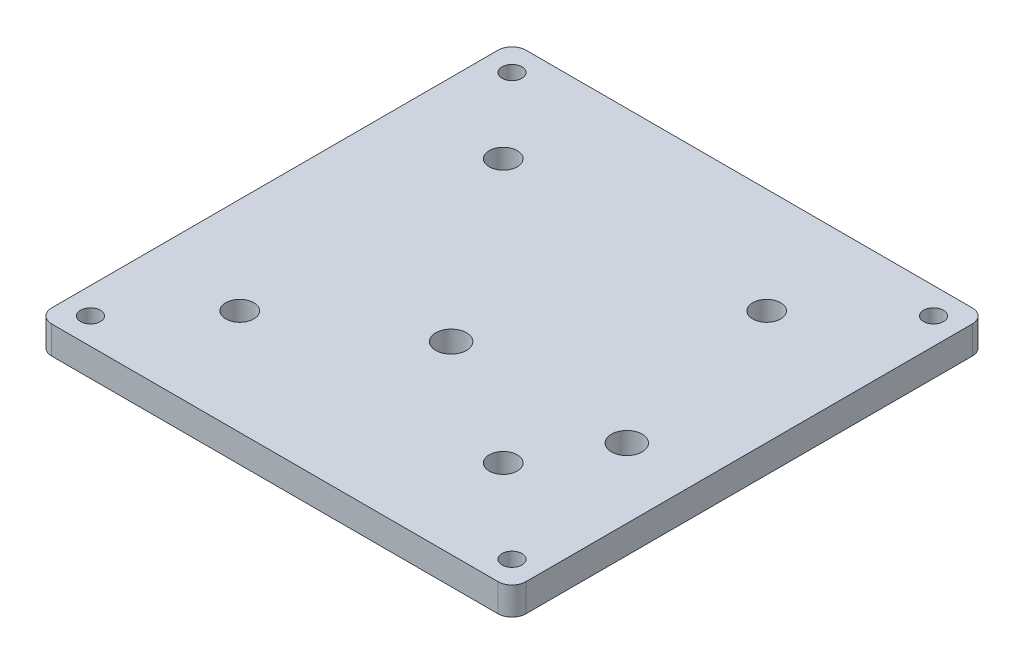
ISO-10303-21;
HEADER;
FILE_DESCRIPTION(('STEP AP214'),'2;1');
FILE_NAME('part.step','',(''),(''),'','','');
FILE_SCHEMA(('AUTOMOTIVE_DESIGN { 1 0 10303 214 1 1 1 1 }'));
ENDSEC;
DATA;
#1=APPLICATION_CONTEXT('core data for automotive mechanical design processes');
#2=APPLICATION_PROTOCOL_DEFINITION('international standard','automotive_design',2000,#1);
#3=PRODUCT_CONTEXT('',#1,'mechanical');
#4=PRODUCT('Part','Part','',(#3));
#5=PRODUCT_RELATED_PRODUCT_CATEGORY('part','',(#4));
#6=PRODUCT_DEFINITION_FORMATION('','',#4);
#7=PRODUCT_DEFINITION_CONTEXT('part definition',#1,'design');
#8=PRODUCT_DEFINITION('design','',#6,#7);
#9=PRODUCT_DEFINITION_SHAPE('','',#8);
#10=(LENGTH_UNIT() NAMED_UNIT(*) SI_UNIT(.MILLI.,.METRE.));
#11=(NAMED_UNIT(*) PLANE_ANGLE_UNIT() SI_UNIT($,.RADIAN.));
#12=(NAMED_UNIT(*) SI_UNIT($,.STERADIAN.) SOLID_ANGLE_UNIT());
#13=UNCERTAINTY_MEASURE_WITH_UNIT(LENGTH_MEASURE(1.E-05),#10,'distance_accuracy_value','');
#14=(GEOMETRIC_REPRESENTATION_CONTEXT(3) GLOBAL_UNCERTAINTY_ASSIGNED_CONTEXT((#13)) GLOBAL_UNIT_ASSIGNED_CONTEXT((#10,
#11,#12)) REPRESENTATION_CONTEXT('',''));
#15=CARTESIAN_POINT('',(0.,0.,0.));
#16=DIRECTION('',(0.,0.,1.));
#17=DIRECTION('',(1.,0.,0.));
#18=AXIS2_PLACEMENT_3D('',#15,#16,#17);
#19=CARTESIAN_POINT('',(0.,3.175,49.));
#20=DIRECTION('',(0.,0.,-1.));
#21=DIRECTION('',(-1.,0.,0.));
#22=AXIS2_PLACEMENT_3D('',#19,#20,#21);
#23=PLANE('',#22);
#24=DIRECTION('',(1.,0.,0.));
#25=VECTOR('',#24,1.);
#26=CARTESIAN_POINT('',(0.,0.,49.));
#27=LINE('',#26,#25);
#28=CARTESIAN_POINT('',(-4.4125,0.,49.));
#29=VERTEX_POINT('',#28);
#30=CARTESIAN_POINT('',(46.4125,0.,49.));
#31=VERTEX_POINT('',#30);
#32=EDGE_CURVE('E138',#29,#31,#27,.T.);
#33=ORIENTED_EDGE('',*,*,#32,.T.);
#34=DIRECTION('',(0.,1.,0.));
#35=VECTOR('',#34,1.);
#36=CARTESIAN_POINT('',(46.4125,3.175,49.));
#37=LINE('',#36,#35);
#38=CARTESIAN_POINT('',(46.4125,3.175,49.));
#39=VERTEX_POINT('',#38);
#40=EDGE_CURVE('E11',#31,#39,#37,.T.);
#41=ORIENTED_EDGE('',*,*,#40,.T.);
#42=DIRECTION('',(1.,0.,0.));
#43=VECTOR('',#42,1.);
#44=CARTESIAN_POINT('',(0.,3.175,49.));
#45=LINE('',#44,#43);
#46=CARTESIAN_POINT('',(-4.4125,3.175,49.));
#47=VERTEX_POINT('',#46);
#48=EDGE_CURVE('E188',#47,#39,#45,.T.);
#49=ORIENTED_EDGE('',*,*,#48,.F.);
#50=DIRECTION('',(0.,1.,0.));
#51=VECTOR('',#50,1.);
#52=CARTESIAN_POINT('',(-4.4125,0.,49.));
#53=LINE('',#52,#51);
#54=EDGE_CURVE('E58',#47,#29,#53,.F.);
#55=ORIENTED_EDGE('',*,*,#54,.T.);
#56=EDGE_LOOP('',(#33,#41,#49,#55));
#57=FACE_BOUND('',#56,.T.);
#58=ADVANCED_FACE('F49',(#57),#23,.F.);
#59=CARTESIAN_POINT('',(35.,3.175,7.));
#60=DIRECTION('',(0.,-1.,0.));
#61=DIRECTION('',(0.,0.,-1.));
#62=AXIS2_PLACEMENT_3D('',#59,#60,#61);
#63=CYLINDRICAL_SURFACE('',#62,1.6);
#64=CARTESIAN_POINT('',(35.,3.175,7.));
#65=DIRECTION('',(0.,1.,0.));
#66=DIRECTION('',(0.,0.,1.));
#67=AXIS2_PLACEMENT_3D('',#64,#65,#66);
#68=CIRCLE('',#67,1.6);
#69=CARTESIAN_POINT('',(35.,3.175,8.59999999999999));
#70=VERTEX_POINT('',#69);
#71=EDGE_CURVE('E235',#70,#70,#68,.T.);
#72=ORIENTED_EDGE('',*,*,#71,.T.);
#73=EDGE_LOOP('',(#72));
#74=FACE_BOUND('',#73,.T.);
#75=CARTESIAN_POINT('',(35.,0.,7.));
#76=DIRECTION('',(0.,1.,0.));
#77=DIRECTION('',(0.,0.,1.));
#78=AXIS2_PLACEMENT_3D('',#75,#76,#77);
#79=CIRCLE('',#78,1.6);
#80=CARTESIAN_POINT('',(35.,0.,8.59999999999999));
#81=VERTEX_POINT('',#80);
#82=EDGE_CURVE('E257',#81,#81,#79,.T.);
#83=ORIENTED_EDGE('',*,*,#82,.F.);
#84=EDGE_LOOP('',(#83));
#85=FACE_BOUND('',#84,.T.);
#86=ADVANCED_FACE('F280',(#74,#85),#63,.F.);
#87=CARTESIAN_POINT('',(35.,3.175,37.));
#88=DIRECTION('',(0.,-1.,0.));
#89=DIRECTION('',(0.,0.,-1.));
#90=AXIS2_PLACEMENT_3D('',#87,#88,#89);
#91=CYLINDRICAL_SURFACE('',#90,1.6);
#92=CARTESIAN_POINT('',(35.,3.175,37.));
#93=DIRECTION('',(0.,1.,0.));
#94=DIRECTION('',(0.,0.,1.));
#95=AXIS2_PLACEMENT_3D('',#92,#93,#94);
#96=CIRCLE('',#95,1.6);
#97=CARTESIAN_POINT('',(35.,3.175,38.6));
#98=VERTEX_POINT('',#97);
#99=EDGE_CURVE('E231',#98,#98,#96,.T.);
#100=ORIENTED_EDGE('',*,*,#99,.T.);
#101=EDGE_LOOP('',(#100));
#102=FACE_BOUND('',#101,.T.);
#103=CARTESIAN_POINT('',(35.,0.,37.));
#104=DIRECTION('',(0.,1.,0.));
#105=DIRECTION('',(0.,0.,1.));
#106=AXIS2_PLACEMENT_3D('',#103,#104,#105);
#107=CIRCLE('',#106,1.6);
#108=CARTESIAN_POINT('',(35.,0.,38.6));
#109=VERTEX_POINT('',#108);
#110=EDGE_CURVE('E253',#109,#109,#107,.T.);
#111=ORIENTED_EDGE('',*,*,#110,.F.);
#112=EDGE_LOOP('',(#111));
#113=FACE_BOUND('',#112,.T.);
#114=ADVANCED_FACE('F285',(#102,#113),#91,.F.);
#115=CARTESIAN_POINT('',(4.99999999999999,3.175,37.));
#116=DIRECTION('',(0.,-1.,0.));
#117=DIRECTION('',(0.,0.,-1.));
#118=AXIS2_PLACEMENT_3D('',#115,#116,#117);
#119=CYLINDRICAL_SURFACE('',#118,1.6);
#120=CARTESIAN_POINT('',(4.99999999999999,3.175,37.));
#121=DIRECTION('',(0.,1.,0.));
#122=DIRECTION('',(0.,0.,1.));
#123=AXIS2_PLACEMENT_3D('',#120,#121,#122);
#124=CIRCLE('',#123,1.6);
#125=CARTESIAN_POINT('',(4.99999999999999,3.175,38.6));
#126=VERTEX_POINT('',#125);
#127=EDGE_CURVE('E227',#126,#126,#124,.T.);
#128=ORIENTED_EDGE('',*,*,#127,.T.);
#129=EDGE_LOOP('',(#128));
#130=FACE_BOUND('',#129,.T.);
#131=CARTESIAN_POINT('',(4.99999999999999,0.,37.));
#132=DIRECTION('',(0.,1.,0.));
#133=DIRECTION('',(0.,0.,1.));
#134=AXIS2_PLACEMENT_3D('',#131,#132,#133);
#135=CIRCLE('',#134,1.6);
#136=CARTESIAN_POINT('',(4.99999999999999,0.,38.6));
#137=VERTEX_POINT('',#136);
#138=EDGE_CURVE('E249',#137,#137,#135,.T.);
#139=ORIENTED_EDGE('',*,*,#138,.F.);
#140=EDGE_LOOP('',(#139));
#141=FACE_BOUND('',#140,.T.);
#142=ADVANCED_FACE('F491',(#130,#141),#119,.F.);
#143=CARTESIAN_POINT('',(20.07,3.175,28.));
#144=DIRECTION('',(0.,-1.,0.));
#145=DIRECTION('',(0.,0.,-1.));
#146=AXIS2_PLACEMENT_3D('',#143,#144,#145);
#147=CYLINDRICAL_SURFACE('',#146,1.75);
#148=CARTESIAN_POINT('',(20.07,3.175,28.));
#149=DIRECTION('',(0.,1.,0.));
#150=DIRECTION('',(0.,0.,1.));
#151=AXIS2_PLACEMENT_3D('',#148,#149,#150);
#152=CIRCLE('',#151,1.75);
#153=CARTESIAN_POINT('',(20.07,3.175,29.75));
#154=VERTEX_POINT('',#153);
#155=EDGE_CURVE('E223',#154,#154,#152,.T.);
#156=ORIENTED_EDGE('',*,*,#155,.T.);
#157=EDGE_LOOP('',(#156));
#158=FACE_BOUND('',#157,.T.);
#159=CARTESIAN_POINT('',(20.07,0.,28.));
#160=DIRECTION('',(0.,1.,0.));
#161=DIRECTION('',(0.,0.,1.));
#162=AXIS2_PLACEMENT_3D('',#159,#160,#161);
#163=CIRCLE('',#162,1.75);
#164=CARTESIAN_POINT('',(20.07,0.,29.75));
#165=VERTEX_POINT('',#164);
#166=EDGE_CURVE('E245',#165,#165,#163,.T.);
#167=ORIENTED_EDGE('',*,*,#166,.F.);
#168=EDGE_LOOP('',(#167));
#169=FACE_BOUND('',#168,.T.);
#170=ADVANCED_FACE('F482',(#158,#169),#147,.F.);
#171=CARTESIAN_POINT('',(40.07,3.175,28.));
#172=DIRECTION('',(0.,-1.,0.));
#173=DIRECTION('',(0.,0.,-1.));
#174=AXIS2_PLACEMENT_3D('',#171,#172,#173);
#175=CYLINDRICAL_SURFACE('',#174,1.75);
#176=CARTESIAN_POINT('',(40.07,3.175,28.));
#177=DIRECTION('',(0.,1.,0.));
#178=DIRECTION('',(0.,0.,1.));
#179=AXIS2_PLACEMENT_3D('',#176,#177,#178);
#180=CIRCLE('',#179,1.75);
#181=CARTESIAN_POINT('',(40.07,3.175,29.75));
#182=VERTEX_POINT('',#181);
#183=EDGE_CURVE('E219',#182,#182,#180,.T.);
#184=ORIENTED_EDGE('',*,*,#183,.T.);
#185=EDGE_LOOP('',(#184));
#186=FACE_BOUND('',#185,.T.);
#187=CARTESIAN_POINT('',(40.07,0.,28.));
#188=DIRECTION('',(0.,1.,0.));
#189=DIRECTION('',(0.,0.,1.));
#190=AXIS2_PLACEMENT_3D('',#187,#188,#189);
#191=CIRCLE('',#190,1.75);
#192=CARTESIAN_POINT('',(40.07,0.,29.75));
#193=VERTEX_POINT('',#192);
#194=EDGE_CURVE('E137',#193,#193,#191,.T.);
#195=ORIENTED_EDGE('',*,*,#194,.F.);
#196=EDGE_LOOP('',(#195));
#197=FACE_BOUND('',#196,.T.);
#198=ADVANCED_FACE('F275',(#186,#197),#175,.F.);
#199=CARTESIAN_POINT('',(0.,3.175,-5.));
#200=DIRECTION('',(0.,0.,-1.));
#201=DIRECTION('',(-1.,0.,0.));
#202=AXIS2_PLACEMENT_3D('',#199,#200,#201);
#203=PLANE('',#202);
#204=DIRECTION('',(1.,0.,0.));
#205=VECTOR('',#204,1.);
#206=CARTESIAN_POINT('',(0.,0.,-5.));
#207=LINE('',#206,#205);
#208=CARTESIAN_POINT('',(-4.41249999999999,0.,-5.));
#209=VERTEX_POINT('',#208);
#210=CARTESIAN_POINT('',(46.4125,0.,-5.));
#211=VERTEX_POINT('',#210);
#212=EDGE_CURVE('E120',#209,#211,#207,.T.);
#213=ORIENTED_EDGE('',*,*,#212,.F.);
#214=DIRECTION('',(0.,1.,0.));
#215=VECTOR('',#214,1.);
#216=CARTESIAN_POINT('',(-4.41249999999999,3.175,-5.));
#217=LINE('',#216,#215);
#218=CARTESIAN_POINT('',(-4.41249999999999,3.175,-5.));
#219=VERTEX_POINT('',#218);
#220=EDGE_CURVE('E132',#209,#219,#217,.T.);
#221=ORIENTED_EDGE('',*,*,#220,.T.);
#222=DIRECTION('',(1.,0.,0.));
#223=VECTOR('',#222,1.);
#224=CARTESIAN_POINT('',(0.,3.175,-5.));
#225=LINE('',#224,#223);
#226=CARTESIAN_POINT('',(46.4125,3.175,-5.));
#227=VERTEX_POINT('',#226);
#228=EDGE_CURVE('E215',#219,#227,#225,.T.);
#229=ORIENTED_EDGE('',*,*,#228,.T.);
#230=DIRECTION('',(0.,1.,0.));
#231=VECTOR('',#230,1.);
#232=CARTESIAN_POINT('',(46.4125,0.,-5.));
#233=LINE('',#232,#231);
#234=EDGE_CURVE('E135',#227,#211,#233,.F.);
#235=ORIENTED_EDGE('',*,*,#234,.T.);
#236=EDGE_LOOP('',(#213,#221,#229,#235));
#237=FACE_BOUND('',#236,.T.);
#238=ADVANCED_FACE('F130',(#237),#203,.T.);
#239=CARTESIAN_POINT('',(4.99999999999999,3.175,7.));
#240=DIRECTION('',(0.,-1.,0.));
#241=DIRECTION('',(0.,0.,-1.));
#242=AXIS2_PLACEMENT_3D('',#239,#240,#241);
#243=CYLINDRICAL_SURFACE('',#242,1.6);
#244=CARTESIAN_POINT('',(4.99999999999999,3.175,7.));
#245=DIRECTION('',(0.,1.,0.));
#246=DIRECTION('',(0.,0.,1.));
#247=AXIS2_PLACEMENT_3D('',#244,#245,#246);
#248=CIRCLE('',#247,1.6);
#249=CARTESIAN_POINT('',(4.99999999999999,3.175,8.6));
#250=VERTEX_POINT('',#249);
#251=EDGE_CURVE('E149',#250,#250,#248,.T.);
#252=ORIENTED_EDGE('',*,*,#251,.T.);
#253=EDGE_LOOP('',(#252));
#254=FACE_BOUND('',#253,.T.);
#255=CARTESIAN_POINT('',(4.99999999999999,0.,7.));
#256=DIRECTION('',(0.,1.,0.));
#257=DIRECTION('',(0.,0.,1.));
#258=AXIS2_PLACEMENT_3D('',#255,#256,#257);
#259=CIRCLE('',#258,1.6);
#260=CARTESIAN_POINT('',(4.99999999999999,0.,8.6));
#261=VERTEX_POINT('',#260);
#262=EDGE_CURVE('E216',#261,#261,#259,.T.);
#263=ORIENTED_EDGE('',*,*,#262,.F.);
#264=EDGE_LOOP('',(#263));
#265=FACE_BOUND('',#264,.T.);
#266=ADVANCED_FACE('F265',(#254,#265),#243,.F.);
#267=CARTESIAN_POINT('',(0.,3.175,0.));
#268=DIRECTION('',(0.,1.,0.));
#269=DIRECTION('',(0.,0.,1.));
#270=AXIS2_PLACEMENT_3D('',#267,#268,#269);
#271=PLANE('',#270);
#272=CARTESIAN_POINT('',(-2.99999999999999,3.175,-2.));
#273=DIRECTION('',(0.,1.,0.));
#274=DIRECTION('',(0.,0.,1.));
#275=AXIS2_PLACEMENT_3D('',#272,#273,#274);
#276=CIRCLE('',#275,1.1303);
#277=CARTESIAN_POINT('',(-2.99999999999999,3.175,-0.869699999999998));
#278=VERTEX_POINT('',#277);
#279=EDGE_CURVE('E336',#278,#278,#276,.T.);
#280=ORIENTED_EDGE('',*,*,#279,.F.);
#281=EDGE_LOOP('',(#280));
#282=FACE_BOUND('',#281,.T.);
#283=CARTESIAN_POINT('',(-3.00000000000001,3.175,46.));
#284=DIRECTION('',(0.,1.,0.));
#285=DIRECTION('',(0.,0.,1.));
#286=AXIS2_PLACEMENT_3D('',#283,#284,#285);
#287=CIRCLE('',#286,1.1303);
#288=CARTESIAN_POINT('',(-3.00000000000001,3.175,47.1303));
#289=VERTEX_POINT('',#288);
#290=EDGE_CURVE('E328',#289,#289,#287,.T.);
#291=ORIENTED_EDGE('',*,*,#290,.F.);
#292=EDGE_LOOP('',(#291));
#293=FACE_BOUND('',#292,.T.);
#294=CARTESIAN_POINT('',(45.,3.175,-2.));
#295=DIRECTION('',(0.,1.,0.));
#296=DIRECTION('',(0.,0.,1.));
#297=AXIS2_PLACEMENT_3D('',#294,#295,#296);
#298=CIRCLE('',#297,1.1303);
#299=CARTESIAN_POINT('',(45.,3.175,-0.869699999999996));
#300=VERTEX_POINT('',#299);
#301=EDGE_CURVE('E320',#300,#300,#298,.T.);
#302=ORIENTED_EDGE('',*,*,#301,.F.);
#303=EDGE_LOOP('',(#302));
#304=FACE_BOUND('',#303,.T.);
#305=CARTESIAN_POINT('',(45.,3.175,46.));
#306=DIRECTION('',(0.,1.,0.));
#307=DIRECTION('',(0.,0.,1.));
#308=AXIS2_PLACEMENT_3D('',#305,#306,#307);
#309=CIRCLE('',#308,1.1303);
#310=CARTESIAN_POINT('',(45.,3.175,47.1303));
#311=VERTEX_POINT('',#310);
#312=EDGE_CURVE('E308',#311,#311,#309,.T.);
#313=ORIENTED_EDGE('',*,*,#312,.F.);
#314=EDGE_LOOP('',(#313));
#315=FACE_BOUND('',#314,.T.);
#316=ORIENTED_EDGE('',*,*,#228,.F.);
#317=CARTESIAN_POINT('',(-4.41249999999999,3.175,-3.4125));
#318=DIRECTION('',(0.,1.,0.));
#319=DIRECTION('',(0.,0.,1.));
#320=AXIS2_PLACEMENT_3D('',#317,#318,#319);
#321=CIRCLE('',#320,1.5875);
#322=CARTESIAN_POINT('',(-5.99999999999999,3.175,-3.4125));
#323=VERTEX_POINT('',#322);
#324=EDGE_CURVE('E141',#219,#323,#321,.T.);
#325=ORIENTED_EDGE('',*,*,#324,.T.);
#326=DIRECTION('',(0.,0.,1.));
#327=VECTOR('',#326,1.);
#328=CARTESIAN_POINT('',(-5.99999999999999,3.175,0.));
#329=LINE('',#328,#327);
#330=CARTESIAN_POINT('',(-6.,3.175,47.4125));
#331=VERTEX_POINT('',#330);
#332=EDGE_CURVE('E199',#323,#331,#329,.T.);
#333=ORIENTED_EDGE('',*,*,#332,.T.);
#334=CARTESIAN_POINT('',(-4.4125,3.175,47.4125));
#335=DIRECTION('',(0.,1.,0.));
#336=DIRECTION('',(0.,0.,1.));
#337=AXIS2_PLACEMENT_3D('',#334,#335,#336);
#338=CIRCLE('',#337,1.5875);
#339=EDGE_CURVE('E143',#331,#47,#338,.T.);
#340=ORIENTED_EDGE('',*,*,#339,.T.);
#341=ORIENTED_EDGE('',*,*,#48,.T.);
#342=CARTESIAN_POINT('',(46.4125,3.175,47.4125));
#343=DIRECTION('',(0.,1.,0.));
#344=DIRECTION('',(0.,0.,1.));
#345=AXIS2_PLACEMENT_3D('',#342,#343,#344);
#346=CIRCLE('',#345,1.5875);
#347=CARTESIAN_POINT('',(48.,3.175,47.4125));
#348=VERTEX_POINT('',#347);
#349=EDGE_CURVE('E147',#39,#348,#346,.T.);
#350=ORIENTED_EDGE('',*,*,#349,.T.);
#351=DIRECTION('',(0.,0.,1.));
#352=VECTOR('',#351,1.);
#353=CARTESIAN_POINT('',(48.,3.175,0.));
#354=LINE('',#353,#352);
#355=CARTESIAN_POINT('',(48.,3.175,-3.4125));
#356=VERTEX_POINT('',#355);
#357=EDGE_CURVE('E209',#356,#348,#354,.T.);
#358=ORIENTED_EDGE('',*,*,#357,.F.);
#359=CARTESIAN_POINT('',(46.4125,3.175,-3.4125));
#360=DIRECTION('',(0.,1.,0.));
#361=DIRECTION('',(0.,0.,1.));
#362=AXIS2_PLACEMENT_3D('',#359,#360,#361);
#363=CIRCLE('',#362,1.5875);
#364=EDGE_CURVE('E155',#356,#227,#363,.T.);
#365=ORIENTED_EDGE('',*,*,#364,.T.);
#366=EDGE_LOOP('',(#316,#325,#333,#340,#341,#350,#358,#365));
#367=FACE_BOUND('',#366,.T.);
#368=ORIENTED_EDGE('',*,*,#183,.F.);
#369=EDGE_LOOP('',(#368));
#370=FACE_BOUND('',#369,.T.);
#371=ORIENTED_EDGE('',*,*,#155,.F.);
#372=EDGE_LOOP('',(#371));
#373=FACE_BOUND('',#372,.T.);
#374=ORIENTED_EDGE('',*,*,#127,.F.);
#375=EDGE_LOOP('',(#374));
#376=FACE_BOUND('',#375,.T.);
#377=ORIENTED_EDGE('',*,*,#99,.F.);
#378=EDGE_LOOP('',(#377));
#379=FACE_BOUND('',#378,.T.);
#380=ORIENTED_EDGE('',*,*,#71,.F.);
#381=EDGE_LOOP('',(#380));
#382=FACE_BOUND('',#381,.T.);
#383=ORIENTED_EDGE('',*,*,#251,.F.);
#384=EDGE_LOOP('',(#383));
#385=FACE_BOUND('',#384,.T.);
#386=ADVANCED_FACE('F201',(#282,#293,#304,#315,#367,#370,#373,#376,#379,#382,#385),#271,.T.);
#387=CARTESIAN_POINT('',(0.,0.,0.));
#388=DIRECTION('',(0.,1.,0.));
#389=DIRECTION('',(0.,0.,1.));
#390=AXIS2_PLACEMENT_3D('',#387,#388,#389);
#391=PLANE('',#390);
#392=CARTESIAN_POINT('',(-2.99999999999999,0.,-2.));
#393=DIRECTION('',(0.,1.,0.));
#394=DIRECTION('',(0.,0.,1.));
#395=AXIS2_PLACEMENT_3D('',#392,#393,#394);
#396=CIRCLE('',#395,1.1303);
#397=CARTESIAN_POINT('',(-2.99999999999999,0.,-0.869699999999998));
#398=VERTEX_POINT('',#397);
#399=EDGE_CURVE('E332',#398,#398,#396,.T.);
#400=ORIENTED_EDGE('',*,*,#399,.T.);
#401=EDGE_LOOP('',(#400));
#402=FACE_BOUND('',#401,.T.);
#403=CARTESIAN_POINT('',(-3.00000000000001,0.,46.));
#404=DIRECTION('',(0.,1.,0.));
#405=DIRECTION('',(0.,0.,1.));
#406=AXIS2_PLACEMENT_3D('',#403,#404,#405);
#407=CIRCLE('',#406,1.1303);
#408=CARTESIAN_POINT('',(-3.00000000000001,0.,47.1303));
#409=VERTEX_POINT('',#408);
#410=EDGE_CURVE('E324',#409,#409,#407,.T.);
#411=ORIENTED_EDGE('',*,*,#410,.T.);
#412=EDGE_LOOP('',(#411));
#413=FACE_BOUND('',#412,.T.);
#414=CARTESIAN_POINT('',(45.,0.,-2.));
#415=DIRECTION('',(0.,1.,0.));
#416=DIRECTION('',(0.,0.,1.));
#417=AXIS2_PLACEMENT_3D('',#414,#415,#416);
#418=CIRCLE('',#417,1.1303);
#419=CARTESIAN_POINT('',(45.,0.,-0.869699999999996));
#420=VERTEX_POINT('',#419);
#421=EDGE_CURVE('E314',#420,#420,#418,.T.);
#422=ORIENTED_EDGE('',*,*,#421,.T.);
#423=EDGE_LOOP('',(#422));
#424=FACE_BOUND('',#423,.T.);
#425=CARTESIAN_POINT('',(45.,0.,46.));
#426=DIRECTION('',(0.,1.,0.));
#427=DIRECTION('',(0.,0.,1.));
#428=AXIS2_PLACEMENT_3D('',#425,#426,#427);
#429=CIRCLE('',#428,1.1303);
#430=CARTESIAN_POINT('',(45.,0.,47.1303));
#431=VERTEX_POINT('',#430);
#432=EDGE_CURVE('E305',#431,#431,#429,.T.);
#433=ORIENTED_EDGE('',*,*,#432,.T.);
#434=EDGE_LOOP('',(#433));
#435=FACE_BOUND('',#434,.T.);
#436=DIRECTION('',(0.,0.,-1.));
#437=VECTOR('',#436,1.);
#438=CARTESIAN_POINT('',(-5.99999999999999,0.,0.));
#439=LINE('',#438,#437);
#440=CARTESIAN_POINT('',(-6.,0.,47.4125));
#441=VERTEX_POINT('',#440);
#442=CARTESIAN_POINT('',(-5.99999999999999,0.,-3.4125));
#443=VERTEX_POINT('',#442);
#444=EDGE_CURVE('E122',#441,#443,#439,.T.);
#445=ORIENTED_EDGE('',*,*,#444,.T.);
#446=CARTESIAN_POINT('',(-4.41249999999999,0.,-3.4125));
#447=DIRECTION('',(0.,1.,0.));
#448=DIRECTION('',(0.,0.,1.));
#449=AXIS2_PLACEMENT_3D('',#446,#447,#448);
#450=CIRCLE('',#449,1.5875);
#451=EDGE_CURVE('E116',#443,#209,#450,.F.);
#452=ORIENTED_EDGE('',*,*,#451,.T.);
#453=ORIENTED_EDGE('',*,*,#212,.T.);
#454=CARTESIAN_POINT('',(46.4125,0.,-3.4125));
#455=DIRECTION('',(0.,1.,0.));
#456=DIRECTION('',(0.,0.,1.));
#457=AXIS2_PLACEMENT_3D('',#454,#455,#456);
#458=CIRCLE('',#457,1.5875);
#459=CARTESIAN_POINT('',(48.,0.,-3.4125));
#460=VERTEX_POINT('',#459);
#461=EDGE_CURVE('E65',#211,#460,#458,.F.);
#462=ORIENTED_EDGE('',*,*,#461,.T.);
#463=DIRECTION('',(0.,0.,-1.));
#464=VECTOR('',#463,1.);
#465=CARTESIAN_POINT('',(48.,0.,0.));
#466=LINE('',#465,#464);
#467=CARTESIAN_POINT('',(48.,0.,47.4125));
#468=VERTEX_POINT('',#467);
#469=EDGE_CURVE('E204',#468,#460,#466,.T.);
#470=ORIENTED_EDGE('',*,*,#469,.F.);
#471=CARTESIAN_POINT('',(46.4125,0.,47.4125));
#472=DIRECTION('',(0.,1.,0.));
#473=DIRECTION('',(0.,0.,1.));
#474=AXIS2_PLACEMENT_3D('',#471,#472,#473);
#475=CIRCLE('',#474,1.5875);
#476=EDGE_CURVE('E170',#468,#31,#475,.F.);
#477=ORIENTED_EDGE('',*,*,#476,.T.);
#478=ORIENTED_EDGE('',*,*,#32,.F.);
#479=CARTESIAN_POINT('',(-4.4125,0.,47.4125));
#480=DIRECTION('',(0.,1.,0.));
#481=DIRECTION('',(0.,0.,1.));
#482=AXIS2_PLACEMENT_3D('',#479,#480,#481);
#483=CIRCLE('',#482,1.5875);
#484=EDGE_CURVE('E167',#29,#441,#483,.F.);
#485=ORIENTED_EDGE('',*,*,#484,.T.);
#486=EDGE_LOOP('',(#445,#452,#453,#462,#470,#477,#478,#485));
#487=FACE_BOUND('',#486,.T.);
#488=ORIENTED_EDGE('',*,*,#194,.T.);
#489=EDGE_LOOP('',(#488));
#490=FACE_BOUND('',#489,.T.);
#491=ORIENTED_EDGE('',*,*,#166,.T.);
#492=EDGE_LOOP('',(#491));
#493=FACE_BOUND('',#492,.T.);
#494=ORIENTED_EDGE('',*,*,#138,.T.);
#495=EDGE_LOOP('',(#494));
#496=FACE_BOUND('',#495,.T.);
#497=ORIENTED_EDGE('',*,*,#110,.T.);
#498=EDGE_LOOP('',(#497));
#499=FACE_BOUND('',#498,.T.);
#500=ORIENTED_EDGE('',*,*,#82,.T.);
#501=EDGE_LOOP('',(#500));
#502=FACE_BOUND('',#501,.T.);
#503=ORIENTED_EDGE('',*,*,#262,.T.);
#504=EDGE_LOOP('',(#503));
#505=FACE_BOUND('',#504,.T.);
#506=ADVANCED_FACE('F118',(#402,#413,#424,#435,#487,#490,#493,#496,#499,#502,#505),#391,.F.);
#507=CARTESIAN_POINT('',(-5.99999999999999,-54.3323108288245,0.));
#508=DIRECTION('',(-1.,0.,0.));
#509=DIRECTION('',(0.,0.,1.));
#510=AXIS2_PLACEMENT_3D('',#507,#508,#509);
#511=PLANE('',#510);
#512=ORIENTED_EDGE('',*,*,#332,.F.);
#513=DIRECTION('',(0.,1.,0.));
#514=VECTOR('',#513,1.);
#515=CARTESIAN_POINT('',(-5.99999999999999,-54.3323108288245,-3.4125));
#516=LINE('',#515,#514);
#517=EDGE_CURVE('E164',#323,#443,#516,.F.);
#518=ORIENTED_EDGE('',*,*,#517,.T.);
#519=ORIENTED_EDGE('',*,*,#444,.F.);
#520=DIRECTION('',(0.,1.,0.));
#521=VECTOR('',#520,1.);
#522=CARTESIAN_POINT('',(-6.,3.175,47.4125));
#523=LINE('',#522,#521);
#524=EDGE_CURVE('E160',#441,#331,#523,.T.);
#525=ORIENTED_EDGE('',*,*,#524,.T.);
#526=EDGE_LOOP('',(#512,#518,#519,#525));
#527=FACE_BOUND('',#526,.T.);
#528=ADVANCED_FACE('F198',(#527),#511,.T.);
#529=CARTESIAN_POINT('',(48.,-54.3323108288245,0.));
#530=DIRECTION('',(-1.,0.,0.));
#531=DIRECTION('',(0.,0.,1.));
#532=AXIS2_PLACEMENT_3D('',#529,#530,#531);
#533=PLANE('',#532);
#534=ORIENTED_EDGE('',*,*,#469,.T.);
#535=DIRECTION('',(0.,1.,0.));
#536=VECTOR('',#535,1.);
#537=CARTESIAN_POINT('',(48.,3.175,-3.4125));
#538=LINE('',#537,#536);
#539=EDGE_CURVE('E177',#460,#356,#538,.T.);
#540=ORIENTED_EDGE('',*,*,#539,.T.);
#541=ORIENTED_EDGE('',*,*,#357,.T.);
#542=DIRECTION('',(0.,1.,0.));
#543=VECTOR('',#542,1.);
#544=CARTESIAN_POINT('',(48.,-54.3323108288245,47.4125));
#545=LINE('',#544,#543);
#546=EDGE_CURVE('E72',#348,#468,#545,.F.);
#547=ORIENTED_EDGE('',*,*,#546,.T.);
#548=EDGE_LOOP('',(#534,#540,#541,#547));
#549=FACE_BOUND('',#548,.T.);
#550=ADVANCED_FACE('F302',(#549),#533,.F.);
#551=CARTESIAN_POINT('',(45.,3.175,46.));
#552=DIRECTION('',(0.,1.,0.));
#553=DIRECTION('',(0.,0.,1.));
#554=AXIS2_PLACEMENT_3D('',#551,#552,#553);
#555=CYLINDRICAL_SURFACE('',#554,1.1303);
#556=ORIENTED_EDGE('',*,*,#432,.F.);
#557=EDGE_LOOP('',(#556));
#558=FACE_BOUND('',#557,.T.);
#559=ORIENTED_EDGE('',*,*,#312,.T.);
#560=EDGE_LOOP('',(#559));
#561=FACE_BOUND('',#560,.T.);
#562=ADVANCED_FACE('F348',(#558,#561),#555,.F.);
#563=CARTESIAN_POINT('',(45.,3.175,-2.));
#564=DIRECTION('',(0.,1.,0.));
#565=DIRECTION('',(0.,0.,1.));
#566=AXIS2_PLACEMENT_3D('',#563,#564,#565);
#567=CYLINDRICAL_SURFACE('',#566,1.1303);
#568=ORIENTED_EDGE('',*,*,#421,.F.);
#569=EDGE_LOOP('',(#568));
#570=FACE_BOUND('',#569,.T.);
#571=ORIENTED_EDGE('',*,*,#301,.T.);
#572=EDGE_LOOP('',(#571));
#573=FACE_BOUND('',#572,.T.);
#574=ADVANCED_FACE('F350',(#570,#573),#567,.F.);
#575=CARTESIAN_POINT('',(-3.00000000000001,3.175,46.));
#576=DIRECTION('',(0.,1.,0.));
#577=DIRECTION('',(0.,0.,1.));
#578=AXIS2_PLACEMENT_3D('',#575,#576,#577);
#579=CYLINDRICAL_SURFACE('',#578,1.1303);
#580=ORIENTED_EDGE('',*,*,#410,.F.);
#581=EDGE_LOOP('',(#580));
#582=FACE_BOUND('',#581,.T.);
#583=ORIENTED_EDGE('',*,*,#290,.T.);
#584=EDGE_LOOP('',(#583));
#585=FACE_BOUND('',#584,.T.);
#586=ADVANCED_FACE('F357',(#582,#585),#579,.F.);
#587=CARTESIAN_POINT('',(-2.99999999999999,3.175,-2.));
#588=DIRECTION('',(0.,1.,0.));
#589=DIRECTION('',(0.,0.,1.));
#590=AXIS2_PLACEMENT_3D('',#587,#588,#589);
#591=CYLINDRICAL_SURFACE('',#590,1.1303);
#592=ORIENTED_EDGE('',*,*,#399,.F.);
#593=EDGE_LOOP('',(#592));
#594=FACE_BOUND('',#593,.T.);
#595=ORIENTED_EDGE('',*,*,#279,.T.);
#596=EDGE_LOOP('',(#595));
#597=FACE_BOUND('',#596,.T.);
#598=ADVANCED_FACE('F292',(#594,#597),#591,.F.);
#599=CARTESIAN_POINT('',(-4.41249999999999,3.175,-3.4125));
#600=DIRECTION('',(0.,1.,0.));
#601=DIRECTION('',(0.,0.,1.));
#602=AXIS2_PLACEMENT_3D('',#599,#600,#601);
#603=CYLINDRICAL_SURFACE('',#602,1.5875);
#604=ORIENTED_EDGE('',*,*,#451,.F.);
#605=ORIENTED_EDGE('',*,*,#517,.F.);
#606=ORIENTED_EDGE('',*,*,#324,.F.);
#607=ORIENTED_EDGE('',*,*,#220,.F.);
#608=EDGE_LOOP('',(#604,#605,#606,#607));
#609=FACE_BOUND('',#608,.T.);
#610=ADVANCED_FACE('F140',(#609),#603,.T.);
#611=CARTESIAN_POINT('',(46.4125,-54.3323108288245,-3.4125));
#612=DIRECTION('',(0.,-1.,0.));
#613=DIRECTION('',(0.,0.,-1.));
#614=AXIS2_PLACEMENT_3D('',#611,#612,#613);
#615=CYLINDRICAL_SURFACE('',#614,1.5875);
#616=ORIENTED_EDGE('',*,*,#461,.F.);
#617=ORIENTED_EDGE('',*,*,#234,.F.);
#618=ORIENTED_EDGE('',*,*,#364,.F.);
#619=ORIENTED_EDGE('',*,*,#539,.F.);
#620=EDGE_LOOP('',(#616,#617,#618,#619));
#621=FACE_BOUND('',#620,.T.);
#622=ADVANCED_FACE('F291',(#621),#615,.T.);
#623=CARTESIAN_POINT('',(46.4125,3.175,47.4125));
#624=DIRECTION('',(0.,1.,0.));
#625=DIRECTION('',(0.,0.,1.));
#626=AXIS2_PLACEMENT_3D('',#623,#624,#625);
#627=CYLINDRICAL_SURFACE('',#626,1.5875);
#628=ORIENTED_EDGE('',*,*,#476,.F.);
#629=ORIENTED_EDGE('',*,*,#546,.F.);
#630=ORIENTED_EDGE('',*,*,#349,.F.);
#631=ORIENTED_EDGE('',*,*,#40,.F.);
#632=EDGE_LOOP('',(#628,#629,#630,#631));
#633=FACE_BOUND('',#632,.T.);
#634=ADVANCED_FACE('F294',(#633),#627,.T.);
#635=CARTESIAN_POINT('',(-4.4125,-54.3323108288245,47.4125));
#636=DIRECTION('',(0.,-1.,0.));
#637=DIRECTION('',(0.,0.,-1.));
#638=AXIS2_PLACEMENT_3D('',#635,#636,#637);
#639=CYLINDRICAL_SURFACE('',#638,1.5875);
#640=ORIENTED_EDGE('',*,*,#484,.F.);
#641=ORIENTED_EDGE('',*,*,#54,.F.);
#642=ORIENTED_EDGE('',*,*,#339,.F.);
#643=ORIENTED_EDGE('',*,*,#524,.F.);
#644=EDGE_LOOP('',(#640,#641,#642,#643));
#645=FACE_BOUND('',#644,.T.);
#646=ADVANCED_FACE('F51',(#645),#639,.T.);
#647=CLOSED_SHELL('',(#58,#86,#114,#142,#170,#198,#238,#266,#386,#506,#528,#550,#562,#574,#586,
#598,#610,#622,#634,#646));
#648=MANIFOLD_SOLID_BREP('B2',#647);
#649=ADVANCED_BREP_SHAPE_REPRESENTATION('',(#18,#648),#14);
#650=SHAPE_DEFINITION_REPRESENTATION(#9,#649);
ENDSEC;
END-ISO-10303-21;
